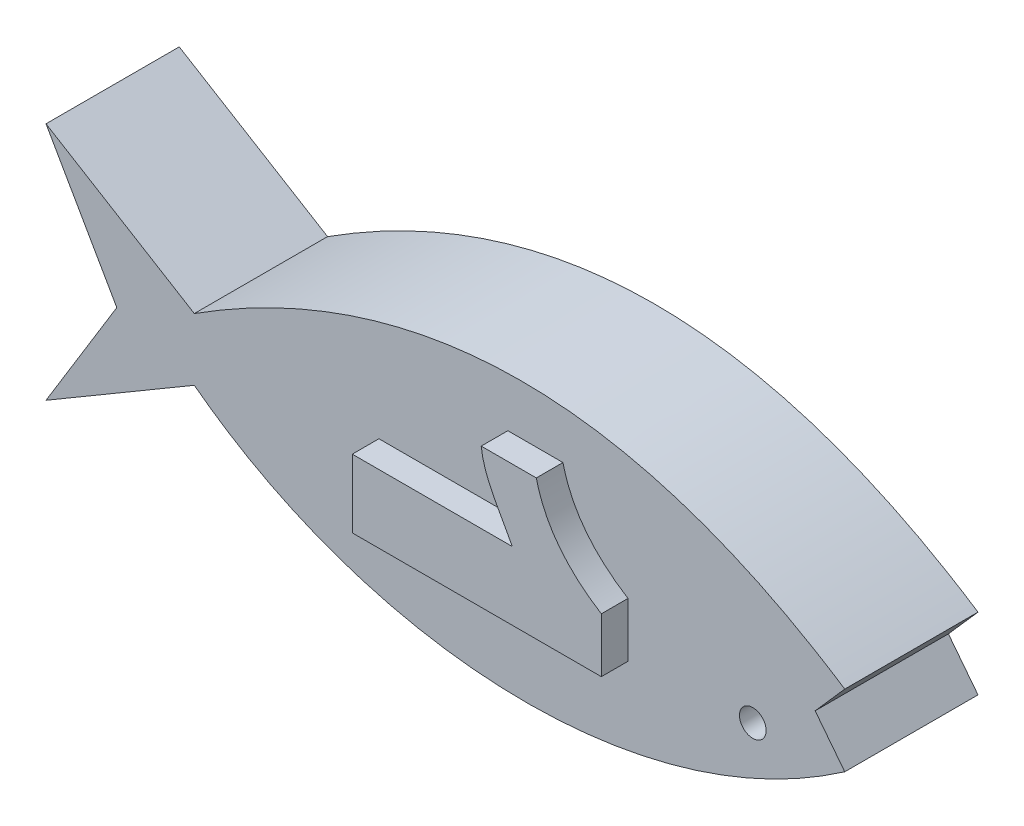
ISO-10303-21;
HEADER;
FILE_DESCRIPTION(('STEP AP214'),'2;1');
FILE_NAME('part.step','',(''),(''),'','','');
FILE_SCHEMA(('AUTOMOTIVE_DESIGN { 1 0 10303 214 1 1 1 1 }'));
ENDSEC;
DATA;
#1=APPLICATION_CONTEXT('core data for automotive mechanical design processes');
#2=APPLICATION_PROTOCOL_DEFINITION('international standard','automotive_design',2000,#1);
#3=PRODUCT_CONTEXT('',#1,'mechanical');
#4=PRODUCT('Part','Part','',(#3));
#5=PRODUCT_RELATED_PRODUCT_CATEGORY('part','',(#4));
#6=PRODUCT_DEFINITION_FORMATION('','',#4);
#7=PRODUCT_DEFINITION_CONTEXT('part definition',#1,'design');
#8=PRODUCT_DEFINITION('design','',#6,#7);
#9=PRODUCT_DEFINITION_SHAPE('','',#8);
#10=(LENGTH_UNIT() NAMED_UNIT(*) SI_UNIT(.MILLI.,.METRE.));
#11=(NAMED_UNIT(*) PLANE_ANGLE_UNIT() SI_UNIT($,.RADIAN.));
#12=(NAMED_UNIT(*) SI_UNIT($,.STERADIAN.) SOLID_ANGLE_UNIT());
#13=UNCERTAINTY_MEASURE_WITH_UNIT(LENGTH_MEASURE(1.E-05),#10,'distance_accuracy_value','');
#14=(GEOMETRIC_REPRESENTATION_CONTEXT(3) GLOBAL_UNCERTAINTY_ASSIGNED_CONTEXT((#13)) GLOBAL_UNIT_ASSIGNED_CONTEXT((#10,
#11,#12)) REPRESENTATION_CONTEXT('',''));
#15=CARTESIAN_POINT('',(0.,0.,0.));
#16=DIRECTION('',(0.,0.,1.));
#17=DIRECTION('',(1.,0.,0.));
#18=AXIS2_PLACEMENT_3D('',#15,#16,#17);
#19=CARTESIAN_POINT('',(17.259438939303,-10.3520637776499,5.));
#20=DIRECTION('',(0.,0.,-1.));
#21=DIRECTION('',(-1.,0.,0.));
#22=AXIS2_PLACEMENT_3D('',#19,#20,#21);
#23=PLANE('',#22);
#24=CARTESIAN_POINT('',(29.9729583496422,-6.64273710384665,5.));
#25=CARTESIAN_POINT('',(22.1417553800262,-12.0787378702692,5.));
#26=CARTESIAN_POINT('',(12.037313537676,-11.2172776076084,5.));
#27=CARTESIAN_POINT('',(5.56534641167516,-6.28572668371996,5.));
#28=B_SPLINE_CURVE_WITH_KNOTS('',3,(#24,#25,#26,#27),.UNSPECIFIED.,.F.,.F.,(4,4),(0.,1.),.UNSPECIFIED.);
#29=CARTESIAN_POINT('',(29.9729583496422,-6.64273710384666,5.));
#30=VERTEX_POINT('',#29);
#31=CARTESIAN_POINT('',(5.56534641167516,-6.28572668371996,5.));
#32=VERTEX_POINT('',#31);
#33=EDGE_CURVE('E174',#30,#32,#28,.T.);
#34=ORIENTED_EDGE('',*,*,#33,.F.);
#35=DIRECTION('',(0.614154388439045,-0.789185901521982,0.));
#36=VECTOR('',#35,1.);
#37=CARTESIAN_POINT('',(29.9729583496422,-6.64273710384666,5.));
#38=LINE('',#37,#36);
#39=CARTESIAN_POINT('',(28.8624377925117,-5.21572268607917,5.));
#40=VERTEX_POINT('',#39);
#41=EDGE_CURVE('E279',#40,#30,#38,.T.);
#42=ORIENTED_EDGE('',*,*,#41,.F.);
#43=DIRECTION('',(-0.660642607187039,-0.750700569847333,0.));
#44=VECTOR('',#43,1.);
#45=CARTESIAN_POINT('',(28.8624377925117,-5.21572268607917,5.));
#46=LINE('',#45,#44);
#47=CARTESIAN_POINT('',(29.9729583496422,-3.95381737449974,5.));
#48=VERTEX_POINT('',#47);
#49=EDGE_CURVE('E202',#48,#40,#46,.T.);
#50=ORIENTED_EDGE('',*,*,#49,.F.);
#51=CARTESIAN_POINT('',(5.56534641167516,-3.95381737449974,5.));
#52=CARTESIAN_POINT('',(17.9190768037639,3.93971731756191,5.));
#53=CARTESIAN_POINT('',(29.9729583496422,-3.95381737449974,5.));
#54=B_SPLINE_CURVE_WITH_KNOTS('',2,(#51,#52,#53),.UNSPECIFIED.,.F.,.F.,(3,3),(0.,1.),.UNSPECIFIED.);
#55=CARTESIAN_POINT('',(5.56534641167516,-3.95381737449974,5.));
#56=VERTEX_POINT('',#55);
#57=EDGE_CURVE('E196',#56,#48,#54,.T.);
#58=ORIENTED_EDGE('',*,*,#57,.F.);
#59=DIRECTION('',(0.854463584925546,-0.519511291538677,0.));
#60=VECTOR('',#59,1.);
#61=CARTESIAN_POINT('',(0.,-0.57010348288733,5.));
#62=LINE('',#61,#60);
#63=CARTESIAN_POINT('',(0.,-0.57010348288733,5.));
#64=VERTEX_POINT('',#63);
#65=EDGE_CURVE('E193',#64,#56,#62,.T.);
#66=ORIENTED_EDGE('',*,*,#65,.F.);
#67=DIRECTION('',(-0.496395302563674,0.868096598076918,0.));
#68=VECTOR('',#67,1.);
#69=CARTESIAN_POINT('',(2.65645960953265,-5.21572268607917,5.));
#70=LINE('',#69,#68);
#71=CARTESIAN_POINT('',(2.65645960953265,-5.21572268607917,5.));
#72=VERTEX_POINT('',#71);
#73=EDGE_CURVE('E190',#72,#64,#70,.T.);
#74=ORIENTED_EDGE('',*,*,#73,.F.);
#75=DIRECTION('',(0.522020846211848,0.852932726608767,0.));
#76=VECTOR('',#75,1.);
#77=CARTESIAN_POINT('',(0.,-9.55612662650962,5.));
#78=LINE('',#77,#76);
#79=CARTESIAN_POINT('',(0.,-9.55612662650962,5.));
#80=VERTEX_POINT('',#79);
#81=EDGE_CURVE('E187',#80,#72,#78,.T.);
#82=ORIENTED_EDGE('',*,*,#81,.F.);
#83=DIRECTION('',(-0.862159793400117,-0.506636448199563,0.));
#84=VECTOR('',#83,1.);
#85=CARTESIAN_POINT('',(5.56534641167516,-6.28572668371996,5.));
#86=LINE('',#85,#84);
#87=EDGE_CURVE('E180',#32,#80,#86,.T.);
#88=ORIENTED_EDGE('',*,*,#87,.F.);
#89=EDGE_LOOP('',(#34,#42,#50,#58,#66,#74,#82,#88));
#90=FACE_BOUND('',#89,.T.);
#91=CARTESIAN_POINT('',(26.5225963003921,-6.78066616591444,5.));
#92=DIRECTION('',(0.,0.,-1.));
#93=DIRECTION('',(-1.,0.,0.));
#94=AXIS2_PLACEMENT_3D('',#91,#92,#93);
#95=CIRCLE('',#94,0.500109692947174);
#96=CARTESIAN_POINT('',(26.0224866074449,-6.78066616591444,5.));
#97=VERTEX_POINT('',#96);
#98=EDGE_CURVE('E166',#97,#97,#95,.T.);
#99=ORIENTED_EDGE('',*,*,#98,.T.);
#100=EDGE_LOOP('',(#99));
#101=FACE_BOUND('',#100,.T.);
#102=CARTESIAN_POINT('',(17.3307115622023,-1.87907555739741,5.));
#103=CARTESIAN_POINT('',(17.4433637660987,-2.88028375944918,5.));
#104=CARTESIAN_POINT('',(18.0409097270519,-3.65981769729691,5.));
#105=CARTESIAN_POINT('',(18.4990791001027,-4.55925057441675,5.));
#106=B_SPLINE_CURVE_WITH_KNOTS('',3,(#102,#103,#104,#105),.UNSPECIFIED.,.F.,.F.,(4,4),(0.,1.),.UNSPECIFIED.);
#107=CARTESIAN_POINT('',(17.3307115622023,-1.87907555739741,5.));
#108=VERTEX_POINT('',#107);
#109=CARTESIAN_POINT('',(18.4990791001027,-4.55925057441675,5.));
#110=VERTEX_POINT('',#109);
#111=EDGE_CURVE('E162',#108,#110,#106,.T.);
#112=ORIENTED_EDGE('',*,*,#111,.F.);
#113=DIRECTION('',(-1.,0.,0.));
#114=VECTOR('',#113,1.);
#115=CARTESIAN_POINT('',(17.3307115622023,-1.87907555739741,5.));
#116=LINE('',#115,#114);
#117=CARTESIAN_POINT('',(19.3982445186762,-1.87907555739741,5.));
#118=VERTEX_POINT('',#117);
#119=EDGE_CURVE('E159',#118,#108,#116,.T.);
#120=ORIENTED_EDGE('',*,*,#119,.F.);
#121=CARTESIAN_POINT('',(21.8386274792977,-5.07519839000636,5.));
#122=CARTESIAN_POINT('',(19.8578937048338,-3.83646927470842,5.));
#123=CARTESIAN_POINT('',(19.3982445186762,-1.87907555739741,5.));
#124=B_SPLINE_CURVE_WITH_KNOTS('',2,(#121,#122,#123),.UNSPECIFIED.,.F.,.F.,(3,3),(0.,1.),.UNSPECIFIED.);
#125=CARTESIAN_POINT('',(21.8386274792977,-5.07519839000636,5.));
#126=VERTEX_POINT('',#125);
#127=EDGE_CURVE('E460',#126,#118,#124,.T.);
#128=ORIENTED_EDGE('',*,*,#127,.F.);
#129=DIRECTION('',(0.,1.,0.));
#130=VECTOR('',#129,1.);
#131=CARTESIAN_POINT('',(21.8386274792977,-5.07519839000636,5.));
#132=LINE('',#131,#130);
#133=CARTESIAN_POINT('',(21.8386274792977,-7.11826472206667,5.));
#134=VERTEX_POINT('',#133);
#135=EDGE_CURVE('E457',#134,#126,#132,.T.);
#136=ORIENTED_EDGE('',*,*,#135,.F.);
#137=DIRECTION('',(1.,0.,0.));
#138=VECTOR('',#137,1.);
#139=CARTESIAN_POINT('',(21.8386274792977,-7.11826472206667,5.));
#140=LINE('',#139,#138);
#141=CARTESIAN_POINT('',(12.4932712813077,-7.11826472206667,5.));
#142=VERTEX_POINT('',#141);
#143=EDGE_CURVE('E454',#142,#134,#140,.T.);
#144=ORIENTED_EDGE('',*,*,#143,.F.);
#145=DIRECTION('',(0.,-1.,0.));
#146=VECTOR('',#145,1.);
#147=CARTESIAN_POINT('',(12.4932712813077,-7.11826472206667,5.));
#148=LINE('',#147,#146);
#149=CARTESIAN_POINT('',(12.4932712813077,-4.55925057441675,5.));
#150=VERTEX_POINT('',#149);
#151=EDGE_CURVE('E56',#150,#142,#148,.T.);
#152=ORIENTED_EDGE('',*,*,#151,.F.);
#153=DIRECTION('',(-1.,0.,0.));
#154=VECTOR('',#153,1.);
#155=CARTESIAN_POINT('',(12.4932712813077,-4.55925057441675,5.));
#156=LINE('',#155,#154);
#157=EDGE_CURVE('E51',#110,#150,#156,.T.);
#158=ORIENTED_EDGE('',*,*,#157,.F.);
#159=EDGE_LOOP('',(#112,#120,#128,#136,#144,#152,#158));
#160=FACE_BOUND('',#159,.T.);
#161=ADVANCED_FACE('F33',(#90,#101,#160),#23,.F.);
#162=DIRECTION('',(0.,0.,-1.));
#163=VECTOR('',#162,1.);
#164=SURFACE_OF_LINEAR_EXTRUSION('',#28,#163);
#165=CARTESIAN_POINT('',(29.9729583496422,-6.64273710384665,0.));
#166=CARTESIAN_POINT('',(22.1417553800262,-12.0787378702692,0.));
#167=CARTESIAN_POINT('',(12.037313537676,-11.2172776076084,0.));
#168=CARTESIAN_POINT('',(5.56534641167516,-6.28572668371996,0.));
#169=B_SPLINE_CURVE_WITH_KNOTS('',3,(#165,#166,#167,#168),.UNSPECIFIED.,.F.,.F.,(4,4),(0.,1.),.UNSPECIFIED.);
#170=CARTESIAN_POINT('',(29.9729583496422,-6.64273710384666,0.));
#171=VERTEX_POINT('',#170);
#172=CARTESIAN_POINT('',(5.56534641167516,-6.28572668371996,0.));
#173=VERTEX_POINT('',#172);
#174=EDGE_CURVE('E173',#171,#173,#169,.T.);
#175=ORIENTED_EDGE('',*,*,#174,.F.);
#176=DIRECTION('',(0.,0.,-1.));
#177=VECTOR('',#176,1.);
#178=CARTESIAN_POINT('',(29.9729583496422,-6.64273710384666,5.));
#179=LINE('',#178,#177);
#180=EDGE_CURVE('E11',#30,#171,#179,.T.);
#181=ORIENTED_EDGE('',*,*,#180,.F.);
#182=ORIENTED_EDGE('',*,*,#33,.T.);
#183=DIRECTION('',(0.,0.,-1.));
#184=VECTOR('',#183,1.);
#185=CARTESIAN_POINT('',(5.56534641167516,-6.28572668371996,5.));
#186=LINE('',#185,#184);
#187=EDGE_CURVE('E38',#32,#173,#186,.T.);
#188=ORIENTED_EDGE('',*,*,#187,.T.);
#189=EDGE_LOOP('',(#175,#181,#182,#188));
#190=FACE_BOUND('',#189,.T.);
#191=ADVANCED_FACE('F35',(#190),#164,.T.);
#192=CARTESIAN_POINT('',(29.9729583496422,-6.64273710384666,5.));
#193=DIRECTION('',(0.789185901521982,0.614154388439045,0.));
#194=DIRECTION('',(-0.614154388439045,0.789185901521982,0.));
#195=AXIS2_PLACEMENT_3D('',#192,#193,#194);
#196=PLANE('',#195);
#197=DIRECTION('',(0.614154388439045,-0.789185901521982,0.));
#198=VECTOR('',#197,1.);
#199=CARTESIAN_POINT('',(29.9729583496422,-6.64273710384666,0.));
#200=LINE('',#199,#198);
#201=CARTESIAN_POINT('',(28.8624377925117,-5.21572268607917,0.));
#202=VERTEX_POINT('',#201);
#203=EDGE_CURVE('E181',#202,#171,#200,.T.);
#204=ORIENTED_EDGE('',*,*,#203,.F.);
#205=DIRECTION('',(0.,0.,-1.));
#206=VECTOR('',#205,1.);
#207=CARTESIAN_POINT('',(28.8624377925117,-5.21572268607917,5.));
#208=LINE('',#207,#206);
#209=EDGE_CURVE('E43',#40,#202,#208,.T.);
#210=ORIENTED_EDGE('',*,*,#209,.F.);
#211=ORIENTED_EDGE('',*,*,#41,.T.);
#212=ORIENTED_EDGE('',*,*,#180,.T.);
#213=EDGE_LOOP('',(#204,#210,#211,#212));
#214=FACE_BOUND('',#213,.T.);
#215=ADVANCED_FACE('F243',(#214),#196,.T.);
#216=CARTESIAN_POINT('',(28.8624377925117,-5.21572268607917,5.));
#217=DIRECTION('',(0.750700569847333,-0.660642607187039,0.));
#218=DIRECTION('',(0.660642607187039,0.750700569847334,0.));
#219=AXIS2_PLACEMENT_3D('',#216,#217,#218);
#220=PLANE('',#219);
#221=DIRECTION('',(-0.660642607187039,-0.750700569847333,0.));
#222=VECTOR('',#221,1.);
#223=CARTESIAN_POINT('',(28.8624377925117,-5.21572268607917,0.));
#224=LINE('',#223,#222);
#225=CARTESIAN_POINT('',(29.9729583496422,-3.95381737449974,0.));
#226=VERTEX_POINT('',#225);
#227=EDGE_CURVE('E263',#226,#202,#224,.T.);
#228=ORIENTED_EDGE('',*,*,#227,.F.);
#229=DIRECTION('',(0.,0.,-1.));
#230=VECTOR('',#229,1.);
#231=CARTESIAN_POINT('',(29.9729583496422,-3.95381737449974,5.));
#232=LINE('',#231,#230);
#233=EDGE_CURVE('E270',#48,#226,#232,.T.);
#234=ORIENTED_EDGE('',*,*,#233,.F.);
#235=ORIENTED_EDGE('',*,*,#49,.T.);
#236=ORIENTED_EDGE('',*,*,#209,.T.);
#237=EDGE_LOOP('',(#228,#234,#235,#236));
#238=FACE_BOUND('',#237,.T.);
#239=ADVANCED_FACE('F213',(#238),#220,.T.);
#240=DIRECTION('',(0.,0.,-1.));
#241=VECTOR('',#240,1.);
#242=SURFACE_OF_LINEAR_EXTRUSION('',#54,#241);
#243=CARTESIAN_POINT('',(5.56534641167516,-3.95381737449974,0.));
#244=CARTESIAN_POINT('',(17.9190768037639,3.93971731756191,0.));
#245=CARTESIAN_POINT('',(29.9729583496422,-3.95381737449974,0.));
#246=B_SPLINE_CURVE_WITH_KNOTS('',2,(#243,#244,#245),.UNSPECIFIED.,.F.,.F.,(3,3),(0.,1.),.UNSPECIFIED.);
#247=CARTESIAN_POINT('',(5.56534641167516,-3.95381737449974,0.));
#248=VERTEX_POINT('',#247);
#249=EDGE_CURVE('E265',#248,#226,#246,.T.);
#250=ORIENTED_EDGE('',*,*,#249,.F.);
#251=DIRECTION('',(0.,0.,-1.));
#252=VECTOR('',#251,1.);
#253=CARTESIAN_POINT('',(5.56534641167516,-3.95381737449974,5.));
#254=LINE('',#253,#252);
#255=EDGE_CURVE('E272',#56,#248,#254,.T.);
#256=ORIENTED_EDGE('',*,*,#255,.F.);
#257=ORIENTED_EDGE('',*,*,#57,.T.);
#258=ORIENTED_EDGE('',*,*,#233,.T.);
#259=EDGE_LOOP('',(#250,#256,#257,#258));
#260=FACE_BOUND('',#259,.T.);
#261=ADVANCED_FACE('F208',(#260),#242,.T.);
#262=CARTESIAN_POINT('',(0.,-0.57010348288733,5.));
#263=DIRECTION('',(0.519511291538677,0.854463584925546,0.));
#264=DIRECTION('',(-0.854463584925546,0.519511291538677,0.));
#265=AXIS2_PLACEMENT_3D('',#262,#263,#264);
#266=PLANE('',#265);
#267=DIRECTION('',(0.854463584925546,-0.519511291538677,0.));
#268=VECTOR('',#267,1.);
#269=CARTESIAN_POINT('',(0.,-0.57010348288733,0.));
#270=LINE('',#269,#268);
#271=CARTESIAN_POINT('',(0.,-0.57010348288733,0.));
#272=VERTEX_POINT('',#271);
#273=EDGE_CURVE('E297',#272,#248,#270,.T.);
#274=ORIENTED_EDGE('',*,*,#273,.F.);
#275=DIRECTION('',(0.,0.,-1.));
#276=VECTOR('',#275,1.);
#277=CARTESIAN_POINT('',(0.,-0.57010348288733,5.));
#278=LINE('',#277,#276);
#279=EDGE_CURVE('E274',#64,#272,#278,.T.);
#280=ORIENTED_EDGE('',*,*,#279,.F.);
#281=ORIENTED_EDGE('',*,*,#65,.T.);
#282=ORIENTED_EDGE('',*,*,#255,.T.);
#283=EDGE_LOOP('',(#274,#280,#281,#282));
#284=FACE_BOUND('',#283,.T.);
#285=ADVANCED_FACE('F212',(#284),#266,.T.);
#286=CARTESIAN_POINT('',(2.65645960953265,-5.21572268607917,5.));
#287=DIRECTION('',(-0.868096598076918,-0.496395302563674,0.));
#288=DIRECTION('',(0.496395302563674,-0.868096598076918,0.));
#289=AXIS2_PLACEMENT_3D('',#286,#287,#288);
#290=PLANE('',#289);
#291=DIRECTION('',(-0.496395302563674,0.868096598076918,0.));
#292=VECTOR('',#291,1.);
#293=CARTESIAN_POINT('',(2.65645960953265,-5.21572268607917,0.));
#294=LINE('',#293,#292);
#295=CARTESIAN_POINT('',(2.65645960953265,-5.21572268607917,0.));
#296=VERTEX_POINT('',#295);
#297=EDGE_CURVE('E294',#296,#272,#294,.T.);
#298=ORIENTED_EDGE('',*,*,#297,.F.);
#299=DIRECTION('',(0.,0.,-1.));
#300=VECTOR('',#299,1.);
#301=CARTESIAN_POINT('',(2.65645960953265,-5.21572268607917,5.));
#302=LINE('',#301,#300);
#303=EDGE_CURVE('E276',#72,#296,#302,.T.);
#304=ORIENTED_EDGE('',*,*,#303,.F.);
#305=ORIENTED_EDGE('',*,*,#73,.T.);
#306=ORIENTED_EDGE('',*,*,#279,.T.);
#307=EDGE_LOOP('',(#298,#304,#305,#306));
#308=FACE_BOUND('',#307,.T.);
#309=ADVANCED_FACE('F218',(#308),#290,.T.);
#310=CARTESIAN_POINT('',(0.,-9.55612662650962,5.));
#311=DIRECTION('',(-0.852932726608767,0.522020846211848,0.));
#312=DIRECTION('',(-0.522020846211848,-0.852932726608767,0.));
#313=AXIS2_PLACEMENT_3D('',#310,#311,#312);
#314=PLANE('',#313);
#315=DIRECTION('',(0.522020846211848,0.852932726608767,0.));
#316=VECTOR('',#315,1.);
#317=CARTESIAN_POINT('',(0.,-9.55612662650962,0.));
#318=LINE('',#317,#316);
#319=CARTESIAN_POINT('',(0.,-9.55612662650962,0.));
#320=VERTEX_POINT('',#319);
#321=EDGE_CURVE('E291',#320,#296,#318,.T.);
#322=ORIENTED_EDGE('',*,*,#321,.F.);
#323=DIRECTION('',(0.,0.,-1.));
#324=VECTOR('',#323,1.);
#325=CARTESIAN_POINT('',(0.,-9.55612662650962,5.));
#326=LINE('',#325,#324);
#327=EDGE_CURVE('E277',#80,#320,#326,.T.);
#328=ORIENTED_EDGE('',*,*,#327,.F.);
#329=ORIENTED_EDGE('',*,*,#81,.T.);
#330=ORIENTED_EDGE('',*,*,#303,.T.);
#331=EDGE_LOOP('',(#322,#328,#329,#330));
#332=FACE_BOUND('',#331,.T.);
#333=ADVANCED_FACE('F222',(#332),#314,.T.);
#334=CARTESIAN_POINT('',(5.56534641167516,-6.28572668371996,5.));
#335=DIRECTION('',(0.506636448199563,-0.862159793400117,0.));
#336=DIRECTION('',(0.862159793400117,0.506636448199563,0.));
#337=AXIS2_PLACEMENT_3D('',#334,#335,#336);
#338=PLANE('',#337);
#339=DIRECTION('',(-0.862159793400117,-0.506636448199563,0.));
#340=VECTOR('',#339,1.);
#341=CARTESIAN_POINT('',(5.56534641167516,-6.28572668371996,0.));
#342=LINE('',#341,#340);
#343=EDGE_CURVE('E285',#173,#320,#342,.T.);
#344=ORIENTED_EDGE('',*,*,#343,.F.);
#345=ORIENTED_EDGE('',*,*,#187,.F.);
#346=ORIENTED_EDGE('',*,*,#87,.T.);
#347=ORIENTED_EDGE('',*,*,#327,.T.);
#348=EDGE_LOOP('',(#344,#345,#346,#347));
#349=FACE_BOUND('',#348,.T.);
#350=ADVANCED_FACE('F225',(#349),#338,.T.);
#351=CARTESIAN_POINT('',(17.259438939303,-10.3520637776499,0.));
#352=DIRECTION('',(0.,0.,-1.));
#353=DIRECTION('',(-1.,0.,0.));
#354=AXIS2_PLACEMENT_3D('',#351,#352,#353);
#355=PLANE('',#354);
#356=CARTESIAN_POINT('',(26.5225963003921,-6.78066616591444,0.));
#357=DIRECTION('',(0.,0.,-1.));
#358=DIRECTION('',(-1.,0.,0.));
#359=AXIS2_PLACEMENT_3D('',#356,#357,#358);
#360=CIRCLE('',#359,0.500109692947174);
#361=CARTESIAN_POINT('',(26.0224866074449,-6.78066616591444,0.));
#362=VERTEX_POINT('',#361);
#363=EDGE_CURVE('E163',#362,#362,#360,.T.);
#364=ORIENTED_EDGE('',*,*,#363,.F.);
#365=EDGE_LOOP('',(#364));
#366=FACE_BOUND('',#365,.T.);
#367=ORIENTED_EDGE('',*,*,#174,.T.);
#368=ORIENTED_EDGE('',*,*,#343,.T.);
#369=ORIENTED_EDGE('',*,*,#321,.T.);
#370=ORIENTED_EDGE('',*,*,#297,.T.);
#371=ORIENTED_EDGE('',*,*,#273,.T.);
#372=ORIENTED_EDGE('',*,*,#249,.T.);
#373=ORIENTED_EDGE('',*,*,#227,.T.);
#374=ORIENTED_EDGE('',*,*,#203,.T.);
#375=EDGE_LOOP('',(#367,#368,#369,#370,#371,#372,#373,#374));
#376=FACE_BOUND('',#375,.T.);
#377=ADVANCED_FACE('F228',(#366,#376),#355,.T.);
#378=CARTESIAN_POINT('',(26.5225963003921,-6.78066616591444,5.));
#379=DIRECTION('',(0.,0.,-1.));
#380=DIRECTION('',(-1.,0.,0.));
#381=AXIS2_PLACEMENT_3D('',#378,#379,#380);
#382=CYLINDRICAL_SURFACE('',#381,0.500109692947174);
#383=ORIENTED_EDGE('',*,*,#98,.F.);
#384=EDGE_LOOP('',(#383));
#385=FACE_BOUND('',#384,.T.);
#386=ORIENTED_EDGE('',*,*,#363,.T.);
#387=EDGE_LOOP('',(#386));
#388=FACE_BOUND('',#387,.T.);
#389=ADVANCED_FACE('F233',(#385,#388),#382,.F.);
#390=CARTESIAN_POINT('',(17.3307115622023,-1.87907555739741,6.));
#391=CARTESIAN_POINT('',(17.4433637660987,-2.88028375944918,6.));
#392=CARTESIAN_POINT('',(18.0409097270519,-3.65981769729691,6.));
#393=CARTESIAN_POINT('',(18.4990791001027,-4.55925057441675,6.));
#394=B_SPLINE_CURVE_WITH_KNOTS('',3,(#390,#391,#392,#393),.UNSPECIFIED.,.F.,.F.,(4,4),(0.,1.),.UNSPECIFIED.);
#395=DIRECTION('',(0.,0.,-1.));
#396=VECTOR('',#395,1.);
#397=SURFACE_OF_LINEAR_EXTRUSION('',#394,#396);
#398=ORIENTED_EDGE('',*,*,#111,.T.);
#399=DIRECTION('',(0.,0.,-1.));
#400=VECTOR('',#399,1.);
#401=CARTESIAN_POINT('',(18.4990791001027,-4.55925057441675,6.));
#402=LINE('',#401,#400);
#403=CARTESIAN_POINT('',(18.4990791001027,-4.55925057441675,6.));
#404=VERTEX_POINT('',#403);
#405=EDGE_CURVE('E143',#404,#110,#402,.T.);
#406=ORIENTED_EDGE('',*,*,#405,.F.);
#407=CARTESIAN_POINT('',(17.3307115622023,-1.87907555739741,6.));
#408=VERTEX_POINT('',#407);
#409=EDGE_CURVE('E150',#408,#404,#394,.T.);
#410=ORIENTED_EDGE('',*,*,#409,.F.);
#411=DIRECTION('',(0.,0.,-1.));
#412=VECTOR('',#411,1.);
#413=CARTESIAN_POINT('',(17.3307115622023,-1.87907555739741,6.));
#414=LINE('',#413,#412);
#415=EDGE_CURVE('E445',#408,#108,#414,.T.);
#416=ORIENTED_EDGE('',*,*,#415,.T.);
#417=EDGE_LOOP('',(#398,#406,#410,#416));
#418=FACE_BOUND('',#417,.T.);
#419=ADVANCED_FACE('F161',(#418),#397,.F.);
#420=CARTESIAN_POINT('',(12.4932712813077,-4.55925057441675,6.));
#421=DIRECTION('',(0.,-1.,0.));
#422=DIRECTION('',(0.,0.,-1.));
#423=AXIS2_PLACEMENT_3D('',#420,#421,#422);
#424=PLANE('',#423);
#425=ORIENTED_EDGE('',*,*,#157,.T.);
#426=DIRECTION('',(0.,0.,-1.));
#427=VECTOR('',#426,1.);
#428=CARTESIAN_POINT('',(12.4932712813077,-4.55925057441675,6.));
#429=LINE('',#428,#427);
#430=CARTESIAN_POINT('',(12.4932712813077,-4.55925057441675,6.));
#431=VERTEX_POINT('',#430);
#432=EDGE_CURVE('E146',#431,#150,#429,.T.);
#433=ORIENTED_EDGE('',*,*,#432,.F.);
#434=DIRECTION('',(-1.,0.,0.));
#435=VECTOR('',#434,1.);
#436=CARTESIAN_POINT('',(12.4932712813077,-4.55925057441675,6.));
#437=LINE('',#436,#435);
#438=EDGE_CURVE('E139',#404,#431,#437,.T.);
#439=ORIENTED_EDGE('',*,*,#438,.F.);
#440=ORIENTED_EDGE('',*,*,#405,.T.);
#441=EDGE_LOOP('',(#425,#433,#439,#440));
#442=FACE_BOUND('',#441,.T.);
#443=ADVANCED_FACE('F141',(#442),#424,.F.);
#444=CARTESIAN_POINT('',(12.4932712813077,-7.11826472206667,6.));
#445=DIRECTION('',(1.,0.,0.));
#446=DIRECTION('',(0.,0.,-1.));
#447=AXIS2_PLACEMENT_3D('',#444,#445,#446);
#448=PLANE('',#447);
#449=ORIENTED_EDGE('',*,*,#151,.T.);
#450=DIRECTION('',(0.,0.,-1.));
#451=VECTOR('',#450,1.);
#452=CARTESIAN_POINT('',(12.4932712813077,-7.11826472206667,6.));
#453=LINE('',#452,#451);
#454=CARTESIAN_POINT('',(12.4932712813077,-7.11826472206667,6.));
#455=VERTEX_POINT('',#454);
#456=EDGE_CURVE('E168',#455,#142,#453,.T.);
#457=ORIENTED_EDGE('',*,*,#456,.F.);
#458=DIRECTION('',(0.,-1.,0.));
#459=VECTOR('',#458,1.);
#460=CARTESIAN_POINT('',(12.4932712813077,-7.11826472206667,6.));
#461=LINE('',#460,#459);
#462=EDGE_CURVE('E149',#431,#455,#461,.T.);
#463=ORIENTED_EDGE('',*,*,#462,.F.);
#464=ORIENTED_EDGE('',*,*,#432,.T.);
#465=EDGE_LOOP('',(#449,#457,#463,#464));
#466=FACE_BOUND('',#465,.T.);
#467=ADVANCED_FACE('F371',(#466),#448,.F.);
#468=CARTESIAN_POINT('',(21.8386274792977,-7.11826472206667,6.));
#469=DIRECTION('',(0.,1.,0.));
#470=DIRECTION('',(0.,0.,1.));
#471=AXIS2_PLACEMENT_3D('',#468,#469,#470);
#472=PLANE('',#471);
#473=ORIENTED_EDGE('',*,*,#143,.T.);
#474=DIRECTION('',(0.,0.,-1.));
#475=VECTOR('',#474,1.);
#476=CARTESIAN_POINT('',(21.8386274792977,-7.11826472206667,6.));
#477=LINE('',#476,#475);
#478=CARTESIAN_POINT('',(21.8386274792977,-7.11826472206667,6.));
#479=VERTEX_POINT('',#478);
#480=EDGE_CURVE('E477',#479,#134,#477,.T.);
#481=ORIENTED_EDGE('',*,*,#480,.F.);
#482=DIRECTION('',(1.,0.,0.));
#483=VECTOR('',#482,1.);
#484=CARTESIAN_POINT('',(21.8386274792977,-7.11826472206667,6.));
#485=LINE('',#484,#483);
#486=EDGE_CURVE('E483',#455,#479,#485,.T.);
#487=ORIENTED_EDGE('',*,*,#486,.F.);
#488=ORIENTED_EDGE('',*,*,#456,.T.);
#489=EDGE_LOOP('',(#473,#481,#487,#488));
#490=FACE_BOUND('',#489,.T.);
#491=ADVANCED_FACE('F380',(#490),#472,.F.);
#492=CARTESIAN_POINT('',(21.8386274792977,-5.07519839000636,6.));
#493=DIRECTION('',(-1.,0.,0.));
#494=DIRECTION('',(0.,0.,1.));
#495=AXIS2_PLACEMENT_3D('',#492,#493,#494);
#496=PLANE('',#495);
#497=ORIENTED_EDGE('',*,*,#135,.T.);
#498=DIRECTION('',(0.,0.,-1.));
#499=VECTOR('',#498,1.);
#500=CARTESIAN_POINT('',(21.8386274792977,-5.07519839000636,6.));
#501=LINE('',#500,#499);
#502=CARTESIAN_POINT('',(21.8386274792977,-5.07519839000636,6.));
#503=VERTEX_POINT('',#502);
#504=EDGE_CURVE('E474',#503,#126,#501,.T.);
#505=ORIENTED_EDGE('',*,*,#504,.F.);
#506=DIRECTION('',(0.,1.,0.));
#507=VECTOR('',#506,1.);
#508=CARTESIAN_POINT('',(21.8386274792977,-5.07519839000636,6.));
#509=LINE('',#508,#507);
#510=EDGE_CURVE('E439',#479,#503,#509,.T.);
#511=ORIENTED_EDGE('',*,*,#510,.F.);
#512=ORIENTED_EDGE('',*,*,#480,.T.);
#513=EDGE_LOOP('',(#497,#505,#511,#512));
#514=FACE_BOUND('',#513,.T.);
#515=ADVANCED_FACE('F390',(#514),#496,.F.);
#516=CARTESIAN_POINT('',(21.8386274792977,-5.07519839000636,6.));
#517=CARTESIAN_POINT('',(19.8578937048338,-3.83646927470842,6.));
#518=CARTESIAN_POINT('',(19.3982445186762,-1.87907555739741,6.));
#519=B_SPLINE_CURVE_WITH_KNOTS('',2,(#516,#517,#518),.UNSPECIFIED.,.F.,.F.,(3,3),(0.,1.),.UNSPECIFIED.);
#520=DIRECTION('',(0.,0.,-1.));
#521=VECTOR('',#520,1.);
#522=SURFACE_OF_LINEAR_EXTRUSION('',#519,#521);
#523=ORIENTED_EDGE('',*,*,#127,.T.);
#524=DIRECTION('',(0.,0.,-1.));
#525=VECTOR('',#524,1.);
#526=CARTESIAN_POINT('',(19.3982445186762,-1.87907555739741,6.));
#527=LINE('',#526,#525);
#528=CARTESIAN_POINT('',(19.3982445186762,-1.87907555739741,6.));
#529=VERTEX_POINT('',#528);
#530=EDGE_CURVE('E471',#529,#118,#527,.T.);
#531=ORIENTED_EDGE('',*,*,#530,.F.);
#532=EDGE_CURVE('E433',#503,#529,#519,.T.);
#533=ORIENTED_EDGE('',*,*,#532,.F.);
#534=ORIENTED_EDGE('',*,*,#504,.T.);
#535=EDGE_LOOP('',(#523,#531,#533,#534));
#536=FACE_BOUND('',#535,.T.);
#537=ADVANCED_FACE('F400',(#536),#522,.F.);
#538=CARTESIAN_POINT('',(17.3307115622023,-1.87907555739741,6.));
#539=DIRECTION('',(0.,-1.,0.));
#540=DIRECTION('',(0.,0.,-1.));
#541=AXIS2_PLACEMENT_3D('',#538,#539,#540);
#542=PLANE('',#541);
#543=ORIENTED_EDGE('',*,*,#119,.T.);
#544=ORIENTED_EDGE('',*,*,#415,.F.);
#545=DIRECTION('',(-1.,0.,0.));
#546=VECTOR('',#545,1.);
#547=CARTESIAN_POINT('',(17.3307115622023,-1.87907555739741,6.));
#548=LINE('',#547,#546);
#549=EDGE_CURVE('E155',#529,#408,#548,.T.);
#550=ORIENTED_EDGE('',*,*,#549,.F.);
#551=ORIENTED_EDGE('',*,*,#530,.T.);
#552=EDGE_LOOP('',(#543,#544,#550,#551));
#553=FACE_BOUND('',#552,.T.);
#554=ADVANCED_FACE('F410',(#553),#542,.F.);
#555=CARTESIAN_POINT('',(17.7853263927196,-3.25732881275655,6.));
#556=DIRECTION('',(0.,0.,-1.));
#557=DIRECTION('',(-1.,0.,0.));
#558=AXIS2_PLACEMENT_3D('',#555,#556,#557);
#559=PLANE('',#558);
#560=ORIENTED_EDGE('',*,*,#409,.T.);
#561=ORIENTED_EDGE('',*,*,#438,.T.);
#562=ORIENTED_EDGE('',*,*,#462,.T.);
#563=ORIENTED_EDGE('',*,*,#486,.T.);
#564=ORIENTED_EDGE('',*,*,#510,.T.);
#565=ORIENTED_EDGE('',*,*,#532,.T.);
#566=ORIENTED_EDGE('',*,*,#549,.T.);
#567=EDGE_LOOP('',(#560,#561,#562,#563,#564,#565,#566));
#568=FACE_BOUND('',#567,.T.);
#569=ADVANCED_FACE('F153',(#568),#559,.F.);
#570=CLOSED_SHELL('',(#161,#191,#215,#239,#261,#285,#309,#333,#350,#377,#389,#419,#443,#467,
#491,#515,#537,#554,#569));
#571=MANIFOLD_SOLID_BREP('B2',#570);
#572=ADVANCED_BREP_SHAPE_REPRESENTATION('',(#18,#571),#14);
#573=SHAPE_DEFINITION_REPRESENTATION(#9,#572);
ENDSEC;
END-ISO-10303-21;
